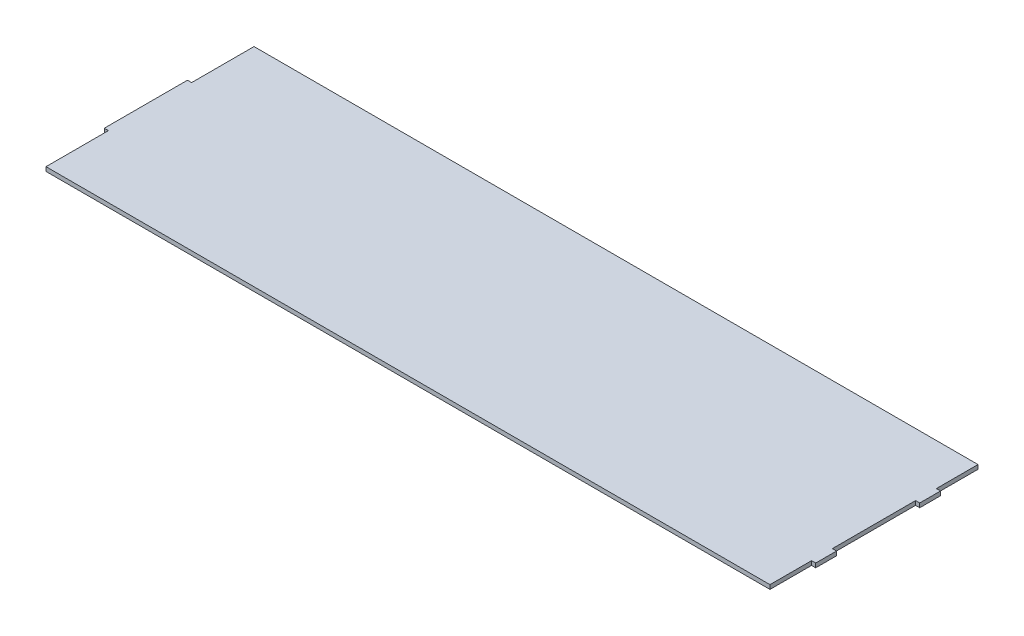
ISO-10303-21;
HEADER;
FILE_DESCRIPTION(('STEP AP214'),'2;1');
FILE_NAME('part.step','',(''),(''),'','','');
FILE_SCHEMA(('AUTOMOTIVE_DESIGN { 1 0 10303 214 1 1 1 1 }'));
ENDSEC;
DATA;
#1=APPLICATION_CONTEXT('core data for automotive mechanical design processes');
#2=APPLICATION_PROTOCOL_DEFINITION('international standard','automotive_design',2000,#1);
#3=PRODUCT_CONTEXT('',#1,'mechanical');
#4=PRODUCT('Part','Part','',(#3));
#5=PRODUCT_RELATED_PRODUCT_CATEGORY('part','',(#4));
#6=PRODUCT_DEFINITION_FORMATION('','',#4);
#7=PRODUCT_DEFINITION_CONTEXT('part definition',#1,'design');
#8=PRODUCT_DEFINITION('design','',#6,#7);
#9=PRODUCT_DEFINITION_SHAPE('','',#8);
#10=(LENGTH_UNIT() NAMED_UNIT(*) SI_UNIT(.MILLI.,.METRE.));
#11=(NAMED_UNIT(*) PLANE_ANGLE_UNIT() SI_UNIT($,.RADIAN.));
#12=(NAMED_UNIT(*) SI_UNIT($,.STERADIAN.) SOLID_ANGLE_UNIT());
#13=UNCERTAINTY_MEASURE_WITH_UNIT(LENGTH_MEASURE(1.E-05),#10,'distance_accuracy_value','');
#14=(GEOMETRIC_REPRESENTATION_CONTEXT(3) GLOBAL_UNCERTAINTY_ASSIGNED_CONTEXT((#13)) GLOBAL_UNIT_ASSIGNED_CONTEXT((#10,
#11,#12)) REPRESENTATION_CONTEXT('',''));
#15=CARTESIAN_POINT('',(0.,0.,0.));
#16=DIRECTION('',(0.,0.,1.));
#17=DIRECTION('',(1.,0.,0.));
#18=AXIS2_PLACEMENT_3D('',#15,#16,#17);
#19=CARTESIAN_POINT('',(0.,2.,-30.));
#20=DIRECTION('',(0.,0.,-1.));
#21=DIRECTION('',(-1.,0.,0.));
#22=AXIS2_PLACEMENT_3D('',#19,#20,#21);
#23=PLANE('',#22);
#24=DIRECTION('',(1.,0.,0.));
#25=VECTOR('',#24,1.);
#26=CARTESIAN_POINT('',(0.,0.,-30.));
#27=LINE('',#26,#25);
#28=CARTESIAN_POINT('',(348.,0.,-30.));
#29=VERTEX_POINT('',#28);
#30=CARTESIAN_POINT('',(350.,0.,-30.));
#31=VERTEX_POINT('',#30);
#32=EDGE_CURVE('E196',#29,#31,#27,.T.);
#33=ORIENTED_EDGE('',*,*,#32,.F.);
#34=DIRECTION('',(0.,-1.,0.));
#35=VECTOR('',#34,1.);
#36=CARTESIAN_POINT('',(348.,2.,-30.));
#37=LINE('',#36,#35);
#38=CARTESIAN_POINT('',(348.,2.,-30.));
#39=VERTEX_POINT('',#38);
#40=EDGE_CURVE('E11',#39,#29,#37,.T.);
#41=ORIENTED_EDGE('',*,*,#40,.F.);
#42=DIRECTION('',(1.,0.,0.));
#43=VECTOR('',#42,1.);
#44=CARTESIAN_POINT('',(0.,2.,-30.));
#45=LINE('',#44,#43);
#46=CARTESIAN_POINT('',(350.,2.,-30.));
#47=VERTEX_POINT('',#46);
#48=EDGE_CURVE('E246',#39,#47,#45,.T.);
#49=ORIENTED_EDGE('',*,*,#48,.T.);
#50=DIRECTION('',(0.,-1.,0.));
#51=VECTOR('',#50,1.);
#52=CARTESIAN_POINT('',(350.,2.,-30.));
#53=LINE('',#52,#51);
#54=EDGE_CURVE('E62',#47,#31,#53,.T.);
#55=ORIENTED_EDGE('',*,*,#54,.T.);
#56=EDGE_LOOP('',(#33,#41,#49,#55));
#57=FACE_BOUND('',#56,.T.);
#58=ADVANCED_FACE('F45',(#57),#23,.T.);
#59=CARTESIAN_POINT('',(348.,2.,0.));
#60=DIRECTION('',(-1.,0.,0.));
#61=DIRECTION('',(0.,0.,1.));
#62=AXIS2_PLACEMENT_3D('',#59,#60,#61);
#63=PLANE('',#62);
#64=DIRECTION('',(0.,0.,-1.));
#65=VECTOR('',#64,1.);
#66=CARTESIAN_POINT('',(348.,0.,0.));
#67=LINE('',#66,#65);
#68=CARTESIAN_POINT('',(348.,0.,-70.));
#69=VERTEX_POINT('',#68);
#70=EDGE_CURVE('E199',#29,#69,#67,.T.);
#71=ORIENTED_EDGE('',*,*,#70,.T.);
#72=DIRECTION('',(0.,-1.,0.));
#73=VECTOR('',#72,1.);
#74=CARTESIAN_POINT('',(348.,2.,-70.));
#75=LINE('',#74,#73);
#76=CARTESIAN_POINT('',(348.,2.,-70.));
#77=VERTEX_POINT('',#76);
#78=EDGE_CURVE('E54',#77,#69,#75,.T.);
#79=ORIENTED_EDGE('',*,*,#78,.F.);
#80=DIRECTION('',(0.,0.,-1.));
#81=VECTOR('',#80,1.);
#82=CARTESIAN_POINT('',(348.,2.,0.));
#83=LINE('',#82,#81);
#84=EDGE_CURVE('E176',#39,#77,#83,.T.);
#85=ORIENTED_EDGE('',*,*,#84,.F.);
#86=ORIENTED_EDGE('',*,*,#40,.T.);
#87=EDGE_LOOP('',(#71,#79,#85,#86));
#88=FACE_BOUND('',#87,.T.);
#89=ADVANCED_FACE('F381',(#88),#63,.F.);
#90=CARTESIAN_POINT('',(0.,2.,-70.));
#91=DIRECTION('',(0.,0.,-1.));
#92=DIRECTION('',(-1.,0.,0.));
#93=AXIS2_PLACEMENT_3D('',#90,#91,#92);
#94=PLANE('',#93);
#95=DIRECTION('',(1.,0.,0.));
#96=VECTOR('',#95,1.);
#97=CARTESIAN_POINT('',(0.,0.,-70.));
#98=LINE('',#97,#96);
#99=CARTESIAN_POINT('',(350.,0.,-70.));
#100=VERTEX_POINT('',#99);
#101=EDGE_CURVE('E202',#69,#100,#98,.T.);
#102=ORIENTED_EDGE('',*,*,#101,.T.);
#103=DIRECTION('',(0.,-1.,0.));
#104=VECTOR('',#103,1.);
#105=CARTESIAN_POINT('',(350.,2.,-70.));
#106=LINE('',#105,#104);
#107=CARTESIAN_POINT('',(350.,2.,-70.));
#108=VERTEX_POINT('',#107);
#109=EDGE_CURVE('E280',#108,#100,#106,.T.);
#110=ORIENTED_EDGE('',*,*,#109,.F.);
#111=DIRECTION('',(1.,0.,0.));
#112=VECTOR('',#111,1.);
#113=CARTESIAN_POINT('',(0.,2.,-70.));
#114=LINE('',#113,#112);
#115=EDGE_CURVE('E290',#77,#108,#114,.T.);
#116=ORIENTED_EDGE('',*,*,#115,.F.);
#117=ORIENTED_EDGE('',*,*,#78,.T.);
#118=EDGE_LOOP('',(#102,#110,#116,#117));
#119=FACE_BOUND('',#118,.T.);
#120=ADVANCED_FACE('F288',(#119),#94,.F.);
#121=CARTESIAN_POINT('',(350.,2.,0.));
#122=DIRECTION('',(1.,0.,0.));
#123=DIRECTION('',(0.,0.,-1.));
#124=AXIS2_PLACEMENT_3D('',#121,#122,#123);
#125=PLANE('',#124);
#126=DIRECTION('',(0.,0.,1.));
#127=VECTOR('',#126,1.);
#128=CARTESIAN_POINT('',(350.,0.,0.));
#129=LINE('',#128,#127);
#130=CARTESIAN_POINT('',(350.,0.,-80.));
#131=VERTEX_POINT('',#130);
#132=EDGE_CURVE('E207',#131,#100,#129,.T.);
#133=ORIENTED_EDGE('',*,*,#132,.F.);
#134=DIRECTION('',(0.,-1.,0.));
#135=VECTOR('',#134,1.);
#136=CARTESIAN_POINT('',(350.,2.,-80.));
#137=LINE('',#136,#135);
#138=CARTESIAN_POINT('',(350.,2.,-80.));
#139=VERTEX_POINT('',#138);
#140=EDGE_CURVE('E277',#139,#131,#137,.T.);
#141=ORIENTED_EDGE('',*,*,#140,.F.);
#142=DIRECTION('',(0.,0.,1.));
#143=VECTOR('',#142,1.);
#144=CARTESIAN_POINT('',(350.,2.,0.));
#145=LINE('',#144,#143);
#146=EDGE_CURVE('E302',#139,#108,#145,.T.);
#147=ORIENTED_EDGE('',*,*,#146,.T.);
#148=ORIENTED_EDGE('',*,*,#109,.T.);
#149=EDGE_LOOP('',(#133,#141,#147,#148));
#150=FACE_BOUND('',#149,.T.);
#151=ADVANCED_FACE('F299',(#150),#125,.T.);
#152=CARTESIAN_POINT('',(0.,2.,-80.));
#153=DIRECTION('',(0.,0.,-1.));
#154=DIRECTION('',(-1.,0.,0.));
#155=AXIS2_PLACEMENT_3D('',#152,#153,#154);
#156=PLANE('',#155);
#157=DIRECTION('',(1.,0.,0.));
#158=VECTOR('',#157,1.);
#159=CARTESIAN_POINT('',(0.,0.,-80.));
#160=LINE('',#159,#158);
#161=CARTESIAN_POINT('',(348.,0.,-80.));
#162=VERTEX_POINT('',#161);
#163=EDGE_CURVE('E211',#162,#131,#160,.T.);
#164=ORIENTED_EDGE('',*,*,#163,.F.);
#165=DIRECTION('',(0.,-1.,0.));
#166=VECTOR('',#165,1.);
#167=CARTESIAN_POINT('',(348.,2.,-80.));
#168=LINE('',#167,#166);
#169=CARTESIAN_POINT('',(348.,2.,-80.));
#170=VERTEX_POINT('',#169);
#171=EDGE_CURVE('E274',#170,#162,#168,.T.);
#172=ORIENTED_EDGE('',*,*,#171,.F.);
#173=DIRECTION('',(1.,0.,0.));
#174=VECTOR('',#173,1.);
#175=CARTESIAN_POINT('',(0.,2.,-80.));
#176=LINE('',#175,#174);
#177=EDGE_CURVE('E306',#170,#139,#176,.T.);
#178=ORIENTED_EDGE('',*,*,#177,.T.);
#179=ORIENTED_EDGE('',*,*,#140,.T.);
#180=EDGE_LOOP('',(#164,#172,#178,#179));
#181=FACE_BOUND('',#180,.T.);
#182=ADVANCED_FACE('F373',(#181),#156,.T.);
#183=CARTESIAN_POINT('',(348.,0.,-100.));
#184=VERTEX_POINT('',#183);
#185=EDGE_CURVE('E203',#162,#184,#67,.T.);
#186=ORIENTED_EDGE('',*,*,#185,.T.);
#187=DIRECTION('',(0.,-1.,0.));
#188=VECTOR('',#187,1.);
#189=CARTESIAN_POINT('',(348.,2.,-100.));
#190=LINE('',#189,#188);
#191=CARTESIAN_POINT('',(348.,2.,-100.));
#192=VERTEX_POINT('',#191);
#193=EDGE_CURVE('E271',#192,#184,#190,.T.);
#194=ORIENTED_EDGE('',*,*,#193,.F.);
#195=EDGE_CURVE('E175',#170,#192,#83,.T.);
#196=ORIENTED_EDGE('',*,*,#195,.F.);
#197=ORIENTED_EDGE('',*,*,#171,.T.);
#198=EDGE_LOOP('',(#186,#194,#196,#197));
#199=FACE_BOUND('',#198,.T.);
#200=ADVANCED_FACE('F362',(#199),#63,.F.);
#201=CARTESIAN_POINT('',(0.,2.,-100.));
#202=DIRECTION('',(0.,0.,-1.));
#203=DIRECTION('',(-1.,0.,0.));
#204=AXIS2_PLACEMENT_3D('',#201,#202,#203);
#205=PLANE('',#204);
#206=DIRECTION('',(1.,0.,0.));
#207=VECTOR('',#206,1.);
#208=CARTESIAN_POINT('',(0.,0.,-100.));
#209=LINE('',#208,#207);
#210=CARTESIAN_POINT('',(0.,0.,-100.));
#211=VERTEX_POINT('',#210);
#212=EDGE_CURVE('E215',#211,#184,#209,.T.);
#213=ORIENTED_EDGE('',*,*,#212,.F.);
#214=DIRECTION('',(0.,-1.,0.));
#215=VECTOR('',#214,1.);
#216=CARTESIAN_POINT('',(0.,2.,-100.));
#217=LINE('',#216,#215);
#218=CARTESIAN_POINT('',(0.,2.,-100.));
#219=VERTEX_POINT('',#218);
#220=EDGE_CURVE('E268',#219,#211,#217,.T.);
#221=ORIENTED_EDGE('',*,*,#220,.F.);
#222=DIRECTION('',(1.,0.,0.));
#223=VECTOR('',#222,1.);
#224=CARTESIAN_POINT('',(0.,2.,-100.));
#225=LINE('',#224,#223);
#226=EDGE_CURVE('E313',#219,#192,#225,.T.);
#227=ORIENTED_EDGE('',*,*,#226,.T.);
#228=ORIENTED_EDGE('',*,*,#193,.T.);
#229=EDGE_LOOP('',(#213,#221,#227,#228));
#230=FACE_BOUND('',#229,.T.);
#231=ADVANCED_FACE('F365',(#230),#205,.T.);
#232=CARTESIAN_POINT('',(0.,2.,0.));
#233=DIRECTION('',(-1.,0.,0.));
#234=DIRECTION('',(0.,0.,1.));
#235=AXIS2_PLACEMENT_3D('',#232,#233,#234);
#236=PLANE('',#235);
#237=DIRECTION('',(0.,0.,-1.));
#238=VECTOR('',#237,1.);
#239=CARTESIAN_POINT('',(0.,0.,0.));
#240=LINE('',#239,#238);
#241=CARTESIAN_POINT('',(0.,0.,-70.));
#242=VERTEX_POINT('',#241);
#243=EDGE_CURVE('E219',#242,#211,#240,.T.);
#244=ORIENTED_EDGE('',*,*,#243,.F.);
#245=DIRECTION('',(0.,-1.,0.));
#246=VECTOR('',#245,1.);
#247=CARTESIAN_POINT('',(0.,2.,-70.));
#248=LINE('',#247,#246);
#249=CARTESIAN_POINT('',(0.,2.,-70.));
#250=VERTEX_POINT('',#249);
#251=EDGE_CURVE('E265',#250,#242,#248,.T.);
#252=ORIENTED_EDGE('',*,*,#251,.F.);
#253=DIRECTION('',(0.,0.,-1.));
#254=VECTOR('',#253,1.);
#255=CARTESIAN_POINT('',(0.,2.,0.));
#256=LINE('',#255,#254);
#257=EDGE_CURVE('E317',#250,#219,#256,.T.);
#258=ORIENTED_EDGE('',*,*,#257,.T.);
#259=ORIENTED_EDGE('',*,*,#220,.T.);
#260=EDGE_LOOP('',(#244,#252,#258,#259));
#261=FACE_BOUND('',#260,.T.);
#262=ADVANCED_FACE('F368',(#261),#236,.T.);
#263=CARTESIAN_POINT('',(0.,2.,-70.));
#264=DIRECTION('',(0.,0.,1.));
#265=DIRECTION('',(1.,0.,0.));
#266=AXIS2_PLACEMENT_3D('',#263,#264,#265);
#267=PLANE('',#266);
#268=DIRECTION('',(-1.,0.,0.));
#269=VECTOR('',#268,1.);
#270=CARTESIAN_POINT('',(0.,0.,-70.));
#271=LINE('',#270,#269);
#272=CARTESIAN_POINT('',(-1.99999999999998,0.,-70.));
#273=VERTEX_POINT('',#272);
#274=EDGE_CURVE('E223',#242,#273,#271,.T.);
#275=ORIENTED_EDGE('',*,*,#274,.T.);
#276=DIRECTION('',(0.,-1.,0.));
#277=VECTOR('',#276,1.);
#278=CARTESIAN_POINT('',(-1.99999999999998,2.,-70.));
#279=LINE('',#278,#277);
#280=CARTESIAN_POINT('',(-1.99999999999998,2.,-70.));
#281=VERTEX_POINT('',#280);
#282=EDGE_CURVE('E262',#281,#273,#279,.T.);
#283=ORIENTED_EDGE('',*,*,#282,.F.);
#284=DIRECTION('',(-1.,0.,0.));
#285=VECTOR('',#284,1.);
#286=CARTESIAN_POINT('',(0.,2.,-70.));
#287=LINE('',#286,#285);
#288=EDGE_CURVE('E321',#250,#281,#287,.T.);
#289=ORIENTED_EDGE('',*,*,#288,.F.);
#290=ORIENTED_EDGE('',*,*,#251,.T.);
#291=EDGE_LOOP('',(#275,#283,#289,#290));
#292=FACE_BOUND('',#291,.T.);
#293=ADVANCED_FACE('F371',(#292),#267,.F.);
#294=CARTESIAN_POINT('',(-2.00000000000002,2.,0.));
#295=DIRECTION('',(-1.,0.,0.));
#296=DIRECTION('',(0.,0.,1.));
#297=AXIS2_PLACEMENT_3D('',#294,#295,#296);
#298=PLANE('',#297);
#299=DIRECTION('',(0.,0.,-1.));
#300=VECTOR('',#299,1.);
#301=CARTESIAN_POINT('',(-2.00000000000002,0.,0.));
#302=LINE('',#301,#300);
#303=CARTESIAN_POINT('',(-2.,0.,-30.));
#304=VERTEX_POINT('',#303);
#305=EDGE_CURVE('E228',#304,#273,#302,.T.);
#306=ORIENTED_EDGE('',*,*,#305,.F.);
#307=DIRECTION('',(0.,-1.,0.));
#308=VECTOR('',#307,1.);
#309=CARTESIAN_POINT('',(-2.,2.,-30.));
#310=LINE('',#309,#308);
#311=CARTESIAN_POINT('',(-2.,2.,-30.));
#312=VERTEX_POINT('',#311);
#313=EDGE_CURVE('E259',#312,#304,#310,.T.);
#314=ORIENTED_EDGE('',*,*,#313,.F.);
#315=DIRECTION('',(0.,0.,-1.));
#316=VECTOR('',#315,1.);
#317=CARTESIAN_POINT('',(-2.00000000000002,2.,0.));
#318=LINE('',#317,#316);
#319=EDGE_CURVE('E325',#312,#281,#318,.T.);
#320=ORIENTED_EDGE('',*,*,#319,.T.);
#321=ORIENTED_EDGE('',*,*,#282,.T.);
#322=EDGE_LOOP('',(#306,#314,#320,#321));
#323=FACE_BOUND('',#322,.T.);
#324=ADVANCED_FACE('F346',(#323),#298,.T.);
#325=CARTESIAN_POINT('',(0.,2.,-30.));
#326=DIRECTION('',(0.,0.,1.));
#327=DIRECTION('',(1.,0.,0.));
#328=AXIS2_PLACEMENT_3D('',#325,#326,#327);
#329=PLANE('',#328);
#330=DIRECTION('',(-1.,0.,0.));
#331=VECTOR('',#330,1.);
#332=CARTESIAN_POINT('',(0.,0.,-30.));
#333=LINE('',#332,#331);
#334=CARTESIAN_POINT('',(0.,0.,-30.));
#335=VERTEX_POINT('',#334);
#336=EDGE_CURVE('E232',#335,#304,#333,.T.);
#337=ORIENTED_EDGE('',*,*,#336,.F.);
#338=DIRECTION('',(0.,-1.,0.));
#339=VECTOR('',#338,1.);
#340=CARTESIAN_POINT('',(0.,2.,-30.));
#341=LINE('',#340,#339);
#342=CARTESIAN_POINT('',(0.,2.,-30.));
#343=VERTEX_POINT('',#342);
#344=EDGE_CURVE('E256',#343,#335,#341,.T.);
#345=ORIENTED_EDGE('',*,*,#344,.F.);
#346=DIRECTION('',(-1.,0.,0.));
#347=VECTOR('',#346,1.);
#348=CARTESIAN_POINT('',(0.,2.,-30.));
#349=LINE('',#348,#347);
#350=EDGE_CURVE('E328',#343,#312,#349,.T.);
#351=ORIENTED_EDGE('',*,*,#350,.T.);
#352=ORIENTED_EDGE('',*,*,#313,.T.);
#353=EDGE_LOOP('',(#337,#345,#351,#352));
#354=FACE_BOUND('',#353,.T.);
#355=ADVANCED_FACE('F347',(#354),#329,.T.);
#356=CARTESIAN_POINT('',(0.,0.,0.));
#357=VERTEX_POINT('',#356);
#358=EDGE_CURVE('E224',#357,#335,#240,.T.);
#359=ORIENTED_EDGE('',*,*,#358,.F.);
#360=DIRECTION('',(0.,-1.,0.));
#361=VECTOR('',#360,1.);
#362=CARTESIAN_POINT('',(0.,2.,0.));
#363=LINE('',#362,#361);
#364=CARTESIAN_POINT('',(0.,2.,0.));
#365=VERTEX_POINT('',#364);
#366=EDGE_CURVE('E253',#365,#357,#363,.T.);
#367=ORIENTED_EDGE('',*,*,#366,.F.);
#368=EDGE_CURVE('E322',#365,#343,#256,.T.);
#369=ORIENTED_EDGE('',*,*,#368,.T.);
#370=ORIENTED_EDGE('',*,*,#344,.T.);
#371=EDGE_LOOP('',(#359,#367,#369,#370));
#372=FACE_BOUND('',#371,.T.);
#373=ADVANCED_FACE('F338',(#372),#236,.T.);
#374=CARTESIAN_POINT('',(0.,2.,0.));
#375=DIRECTION('',(0.,0.,-1.));
#376=DIRECTION('',(-1.,0.,0.));
#377=AXIS2_PLACEMENT_3D('',#374,#375,#376);
#378=PLANE('',#377);
#379=DIRECTION('',(1.,0.,0.));
#380=VECTOR('',#379,1.);
#381=CARTESIAN_POINT('',(0.,0.,0.));
#382=LINE('',#381,#380);
#383=CARTESIAN_POINT('',(348.,0.,0.));
#384=VERTEX_POINT('',#383);
#385=EDGE_CURVE('E236',#357,#384,#382,.T.);
#386=ORIENTED_EDGE('',*,*,#385,.T.);
#387=DIRECTION('',(0.,-1.,0.));
#388=VECTOR('',#387,1.);
#389=CARTESIAN_POINT('',(348.,2.,0.));
#390=LINE('',#389,#388);
#391=CARTESIAN_POINT('',(348.,2.,0.));
#392=VERTEX_POINT('',#391);
#393=EDGE_CURVE('E185',#392,#384,#390,.T.);
#394=ORIENTED_EDGE('',*,*,#393,.F.);
#395=DIRECTION('',(1.,0.,0.));
#396=VECTOR('',#395,1.);
#397=CARTESIAN_POINT('',(0.,2.,0.));
#398=LINE('',#397,#396);
#399=EDGE_CURVE('E169',#365,#392,#398,.T.);
#400=ORIENTED_EDGE('',*,*,#399,.F.);
#401=ORIENTED_EDGE('',*,*,#366,.T.);
#402=EDGE_LOOP('',(#386,#394,#400,#401));
#403=FACE_BOUND('',#402,.T.);
#404=ADVANCED_FACE('F400',(#403),#378,.F.);
#405=CARTESIAN_POINT('',(348.,0.,-20.));
#406=VERTEX_POINT('',#405);
#407=EDGE_CURVE('E181',#384,#406,#67,.T.);
#408=ORIENTED_EDGE('',*,*,#407,.T.);
#409=DIRECTION('',(0.,-1.,0.));
#410=VECTOR('',#409,1.);
#411=CARTESIAN_POINT('',(348.,2.,-20.));
#412=LINE('',#411,#410);
#413=CARTESIAN_POINT('',(348.,2.,-20.));
#414=VERTEX_POINT('',#413);
#415=EDGE_CURVE('E178',#414,#406,#412,.T.);
#416=ORIENTED_EDGE('',*,*,#415,.F.);
#417=EDGE_CURVE('E160',#392,#414,#83,.T.);
#418=ORIENTED_EDGE('',*,*,#417,.F.);
#419=ORIENTED_EDGE('',*,*,#393,.T.);
#420=EDGE_LOOP('',(#408,#416,#418,#419));
#421=FACE_BOUND('',#420,.T.);
#422=ADVANCED_FACE('F179',(#421),#63,.F.);
#423=CARTESIAN_POINT('',(0.,2.,-20.));
#424=DIRECTION('',(0.,0.,-1.));
#425=DIRECTION('',(-1.,0.,0.));
#426=AXIS2_PLACEMENT_3D('',#423,#424,#425);
#427=PLANE('',#426);
#428=DIRECTION('',(1.,0.,0.));
#429=VECTOR('',#428,1.);
#430=CARTESIAN_POINT('',(0.,0.,-20.));
#431=LINE('',#430,#429);
#432=CARTESIAN_POINT('',(350.,0.,-20.));
#433=VERTEX_POINT('',#432);
#434=EDGE_CURVE('E239',#406,#433,#431,.T.);
#435=ORIENTED_EDGE('',*,*,#434,.T.);
#436=DIRECTION('',(0.,-1.,0.));
#437=VECTOR('',#436,1.);
#438=CARTESIAN_POINT('',(350.,2.,-20.));
#439=LINE('',#438,#437);
#440=CARTESIAN_POINT('',(350.,2.,-20.));
#441=VERTEX_POINT('',#440);
#442=EDGE_CURVE('E112',#441,#433,#439,.T.);
#443=ORIENTED_EDGE('',*,*,#442,.F.);
#444=DIRECTION('',(1.,0.,0.));
#445=VECTOR('',#444,1.);
#446=CARTESIAN_POINT('',(0.,2.,-20.));
#447=LINE('',#446,#445);
#448=EDGE_CURVE('E166',#414,#441,#447,.T.);
#449=ORIENTED_EDGE('',*,*,#448,.F.);
#450=ORIENTED_EDGE('',*,*,#415,.T.);
#451=EDGE_LOOP('',(#435,#443,#449,#450));
#452=FACE_BOUND('',#451,.T.);
#453=ADVANCED_FACE('F187',(#452),#427,.F.);
#454=CARTESIAN_POINT('',(350.,2.,0.));
#455=DIRECTION('',(1.,0.,0.));
#456=DIRECTION('',(0.,0.,-1.));
#457=AXIS2_PLACEMENT_3D('',#454,#455,#456);
#458=PLANE('',#457);
#459=DIRECTION('',(0.,0.,1.));
#460=VECTOR('',#459,1.);
#461=CARTESIAN_POINT('',(350.,0.,0.));
#462=LINE('',#461,#460);
#463=EDGE_CURVE('E242',#31,#433,#462,.T.);
#464=ORIENTED_EDGE('',*,*,#463,.F.);
#465=ORIENTED_EDGE('',*,*,#54,.F.);
#466=DIRECTION('',(0.,0.,1.));
#467=VECTOR('',#466,1.);
#468=CARTESIAN_POINT('',(350.,2.,0.));
#469=LINE('',#468,#467);
#470=EDGE_CURVE('E189',#47,#441,#469,.T.);
#471=ORIENTED_EDGE('',*,*,#470,.T.);
#472=ORIENTED_EDGE('',*,*,#442,.T.);
#473=EDGE_LOOP('',(#464,#465,#471,#472));
#474=FACE_BOUND('',#473,.T.);
#475=ADVANCED_FACE('F388',(#474),#458,.T.);
#476=CARTESIAN_POINT('',(0.,2.,0.));
#477=DIRECTION('',(0.,1.,0.));
#478=DIRECTION('',(0.,0.,1.));
#479=AXIS2_PLACEMENT_3D('',#476,#477,#478);
#480=PLANE('',#479);
#481=ORIENTED_EDGE('',*,*,#48,.F.);
#482=ORIENTED_EDGE('',*,*,#84,.T.);
#483=ORIENTED_EDGE('',*,*,#115,.T.);
#484=ORIENTED_EDGE('',*,*,#146,.F.);
#485=ORIENTED_EDGE('',*,*,#177,.F.);
#486=ORIENTED_EDGE('',*,*,#195,.T.);
#487=ORIENTED_EDGE('',*,*,#226,.F.);
#488=ORIENTED_EDGE('',*,*,#257,.F.);
#489=ORIENTED_EDGE('',*,*,#288,.T.);
#490=ORIENTED_EDGE('',*,*,#319,.F.);
#491=ORIENTED_EDGE('',*,*,#350,.F.);
#492=ORIENTED_EDGE('',*,*,#368,.F.);
#493=ORIENTED_EDGE('',*,*,#399,.T.);
#494=ORIENTED_EDGE('',*,*,#417,.T.);
#495=ORIENTED_EDGE('',*,*,#448,.T.);
#496=ORIENTED_EDGE('',*,*,#470,.F.);
#497=EDGE_LOOP('',(#481,#482,#483,#484,#485,#486,#487,#488,#489,#490,#491,#492,#493,#494,#495,#496));
#498=FACE_BOUND('',#497,.T.);
#499=ADVANCED_FACE('F163',(#498),#480,.T.);
#500=CARTESIAN_POINT('',(0.,0.,0.));
#501=DIRECTION('',(0.,1.,0.));
#502=DIRECTION('',(0.,0.,1.));
#503=AXIS2_PLACEMENT_3D('',#500,#501,#502);
#504=PLANE('',#503);
#505=ORIENTED_EDGE('',*,*,#32,.T.);
#506=ORIENTED_EDGE('',*,*,#463,.T.);
#507=ORIENTED_EDGE('',*,*,#434,.F.);
#508=ORIENTED_EDGE('',*,*,#407,.F.);
#509=ORIENTED_EDGE('',*,*,#385,.F.);
#510=ORIENTED_EDGE('',*,*,#358,.T.);
#511=ORIENTED_EDGE('',*,*,#336,.T.);
#512=ORIENTED_EDGE('',*,*,#305,.T.);
#513=ORIENTED_EDGE('',*,*,#274,.F.);
#514=ORIENTED_EDGE('',*,*,#243,.T.);
#515=ORIENTED_EDGE('',*,*,#212,.T.);
#516=ORIENTED_EDGE('',*,*,#185,.F.);
#517=ORIENTED_EDGE('',*,*,#163,.T.);
#518=ORIENTED_EDGE('',*,*,#132,.T.);
#519=ORIENTED_EDGE('',*,*,#101,.F.);
#520=ORIENTED_EDGE('',*,*,#70,.F.);
#521=EDGE_LOOP('',(#505,#506,#507,#508,#509,#510,#511,#512,#513,#514,#515,#516,#517,#518,#519,#520));
#522=FACE_BOUND('',#521,.T.);
#523=ADVANCED_FACE('F294',(#522),#504,.F.);
#524=CLOSED_SHELL('',(#58,#89,#120,#151,#182,#200,#231,#262,#293,#324,#355,#373,#404,#422,#453,
#475,#499,#523));
#525=MANIFOLD_SOLID_BREP('B2',#524);
#526=ADVANCED_BREP_SHAPE_REPRESENTATION('',(#18,#525),#14);
#527=SHAPE_DEFINITION_REPRESENTATION(#9,#526);
ENDSEC;
END-ISO-10303-21;
